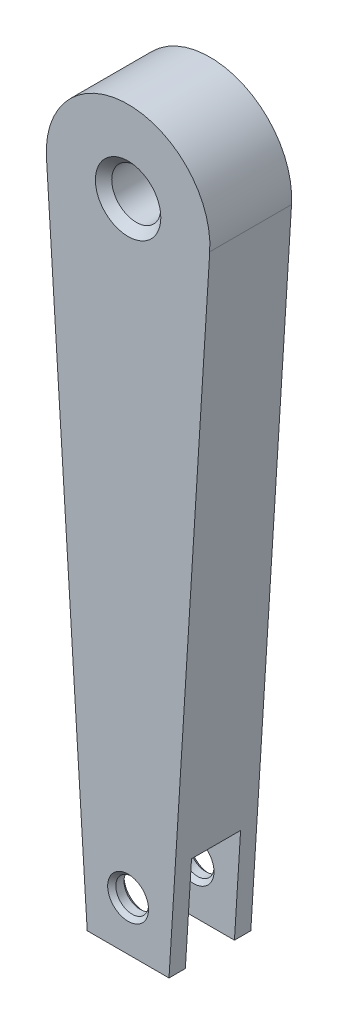
ISO-10303-21;
HEADER;
FILE_DESCRIPTION(('STEP AP214'),'2;1');
FILE_NAME('part.step','',(''),(''),'','','');
FILE_SCHEMA(('AUTOMOTIVE_DESIGN { 1 0 10303 214 1 1 1 1 }'));
ENDSEC;
DATA;
#1=APPLICATION_CONTEXT('core data for automotive mechanical design processes');
#2=APPLICATION_PROTOCOL_DEFINITION('international standard','automotive_design',2000,#1);
#3=PRODUCT_CONTEXT('',#1,'mechanical');
#4=PRODUCT('Part','Part','',(#3));
#5=PRODUCT_RELATED_PRODUCT_CATEGORY('part','',(#4));
#6=PRODUCT_DEFINITION_FORMATION('','',#4);
#7=PRODUCT_DEFINITION_CONTEXT('part definition',#1,'design');
#8=PRODUCT_DEFINITION('design','',#6,#7);
#9=PRODUCT_DEFINITION_SHAPE('','',#8);
#10=(LENGTH_UNIT() NAMED_UNIT(*) SI_UNIT(.MILLI.,.METRE.));
#11=(NAMED_UNIT(*) PLANE_ANGLE_UNIT() SI_UNIT($,.RADIAN.));
#12=(NAMED_UNIT(*) SI_UNIT($,.STERADIAN.) SOLID_ANGLE_UNIT());
#13=UNCERTAINTY_MEASURE_WITH_UNIT(LENGTH_MEASURE(1.E-05),#10,'distance_accuracy_value','');
#14=(GEOMETRIC_REPRESENTATION_CONTEXT(3) GLOBAL_UNCERTAINTY_ASSIGNED_CONTEXT((#13)) GLOBAL_UNIT_ASSIGNED_CONTEXT((#10,
#11,#12)) REPRESENTATION_CONTEXT('',''));
#15=CARTESIAN_POINT('',(0.,0.,0.));
#16=DIRECTION('',(0.,0.,1.));
#17=DIRECTION('',(1.,0.,0.));
#18=AXIS2_PLACEMENT_3D('',#15,#16,#17);
#19=CARTESIAN_POINT('',(-4.99999999999999,-80.,91.8451418704305));
#20=DIRECTION('',(0.,1.,0.));
#21=DIRECTION('',(0.,0.,1.));
#22=AXIS2_PLACEMENT_3D('',#19,#20,#21);
#23=PLANE('',#22);
#24=DIRECTION('',(0.,0.,-1.));
#25=VECTOR('',#24,1.);
#26=CARTESIAN_POINT('',(-4.99999999999999,-80.,91.8451418704305));
#27=LINE('',#26,#25);
#28=CARTESIAN_POINT('',(-4.99999999999999,-80.,9.99999999999999));
#29=VERTEX_POINT('',#28);
#30=CARTESIAN_POINT('',(-4.99999999999999,-80.,8.00000000000001));
#31=VERTEX_POINT('',#30);
#32=EDGE_CURVE('E152',#29,#31,#27,.T.);
#33=ORIENTED_EDGE('',*,*,#32,.T.);
#34=DIRECTION('',(1.,0.,0.));
#35=VECTOR('',#34,1.);
#36=CARTESIAN_POINT('',(-4.99999999999999,-80.,8.00000000000001));
#37=LINE('',#36,#35);
#38=CARTESIAN_POINT('',(5.00000000000001,-80.,8.00000000000001));
#39=VERTEX_POINT('',#38);
#40=EDGE_CURVE('E127',#31,#39,#37,.T.);
#41=ORIENTED_EDGE('',*,*,#40,.T.);
#42=DIRECTION('',(0.,0.,-1.));
#43=VECTOR('',#42,1.);
#44=CARTESIAN_POINT('',(5.00000000000001,-80.,91.8451418704305));
#45=LINE('',#44,#43);
#46=CARTESIAN_POINT('',(5.00000000000001,-80.,9.99999999999999));
#47=VERTEX_POINT('',#46);
#48=EDGE_CURVE('E147',#47,#39,#45,.T.);
#49=ORIENTED_EDGE('',*,*,#48,.F.);
#50=DIRECTION('',(1.,0.,0.));
#51=VECTOR('',#50,1.);
#52=CARTESIAN_POINT('',(-4.99999999999999,-80.,9.99999999999999));
#53=LINE('',#52,#51);
#54=EDGE_CURVE('E157',#29,#47,#53,.T.);
#55=ORIENTED_EDGE('',*,*,#54,.F.);
#56=EDGE_LOOP('',(#33,#41,#49,#55));
#57=FACE_BOUND('',#56,.T.);
#58=ADVANCED_FACE('F40',(#57),#23,.F.);
#59=CARTESIAN_POINT('',(0.,0.,10.));
#60=DIRECTION('',(0.,0.,-1.));
#61=DIRECTION('',(-1.,0.,0.));
#62=AXIS2_PLACEMENT_3D('',#59,#60,#61);
#63=CYLINDRICAL_SURFACE('',#62,10.);
#64=CARTESIAN_POINT('',(0.,0.,10.));
#65=DIRECTION('',(0.,0.,1.));
#66=DIRECTION('',(1.,0.,0.));
#67=AXIS2_PLACEMENT_3D('',#64,#65,#66);
#68=CIRCLE('',#67,10.);
#69=CARTESIAN_POINT('',(9.98037274433424,-0.626226703479116,10.));
#70=VERTEX_POINT('',#69);
#71=CARTESIAN_POINT('',(-9.98037274433424,-0.626226703479112,10.));
#72=VERTEX_POINT('',#71);
#73=EDGE_CURVE('E64',#70,#72,#68,.T.);
#74=ORIENTED_EDGE('',*,*,#73,.F.);
#75=DIRECTION('',(0.,0.,-1.));
#76=VECTOR('',#75,1.);
#77=CARTESIAN_POINT('',(9.98037274433424,-0.626226703479116,91.8451418704305));
#78=LINE('',#77,#76);
#79=CARTESIAN_POINT('',(9.98037274433424,-0.626226703479116,0.));
#80=VERTEX_POINT('',#79);
#81=EDGE_CURVE('E146',#70,#80,#78,.T.);
#82=ORIENTED_EDGE('',*,*,#81,.T.);
#83=CARTESIAN_POINT('',(0.,0.,0.));
#84=DIRECTION('',(0.,0.,1.));
#85=DIRECTION('',(1.,0.,0.));
#86=AXIS2_PLACEMENT_3D('',#83,#84,#85);
#87=CIRCLE('',#86,10.);
#88=CARTESIAN_POINT('',(-9.98037274433424,-0.626226703479112,0.));
#89=VERTEX_POINT('',#88);
#90=EDGE_CURVE('E156',#80,#89,#87,.T.);
#91=ORIENTED_EDGE('',*,*,#90,.T.);
#92=DIRECTION('',(0.,0.,-1.));
#93=VECTOR('',#92,1.);
#94=CARTESIAN_POINT('',(-9.98037274433424,-0.626226703479113,91.8451418704305));
#95=LINE('',#94,#93);
#96=EDGE_CURVE('E142',#72,#89,#95,.T.);
#97=ORIENTED_EDGE('',*,*,#96,.F.);
#98=EDGE_LOOP('',(#74,#82,#91,#97));
#99=FACE_BOUND('',#98,.T.);
#100=ADVANCED_FACE('F233',(#99),#63,.T.);
#101=CARTESIAN_POINT('',(0.,0.,10.));
#102=DIRECTION('',(0.,0.,1.));
#103=DIRECTION('',(1.,0.,0.));
#104=AXIS2_PLACEMENT_3D('',#101,#102,#103);
#105=PLANE('',#104);
#106=CARTESIAN_POINT('',(0.,-74.,10.));
#107=DIRECTION('',(0.,0.,1.));
#108=DIRECTION('',(1.,0.,0.));
#109=AXIS2_PLACEMENT_3D('',#106,#107,#108);
#110=CIRCLE('',#109,2.5);
#111=CARTESIAN_POINT('',(2.5,-74.,10.));
#112=VERTEX_POINT('',#111);
#113=EDGE_CURVE('E11',#112,#112,#110,.F.);
#114=ORIENTED_EDGE('',*,*,#113,.T.);
#115=EDGE_LOOP('',(#114));
#116=FACE_BOUND('',#115,.T.);
#117=CARTESIAN_POINT('',(0.,0.,10.));
#118=DIRECTION('',(0.,0.,1.));
#119=DIRECTION('',(1.,0.,0.));
#120=AXIS2_PLACEMENT_3D('',#117,#118,#119);
#121=CIRCLE('',#120,3.99999999999999);
#122=CARTESIAN_POINT('',(3.99999999999999,0.,10.));
#123=VERTEX_POINT('',#122);
#124=EDGE_CURVE('E176',#123,#123,#121,.F.);
#125=ORIENTED_EDGE('',*,*,#124,.T.);
#126=EDGE_LOOP('',(#125));
#127=FACE_BOUND('',#126,.T.);
#128=ORIENTED_EDGE('',*,*,#73,.T.);
#129=DIRECTION('',(0.0626226703479112,-0.998037274433424,0.));
#130=VECTOR('',#129,1.);
#131=CARTESIAN_POINT('',(-9.98037274433424,-0.626226703479113,9.99999999999999));
#132=LINE('',#131,#130);
#133=EDGE_CURVE('E141',#72,#29,#132,.T.);
#134=ORIENTED_EDGE('',*,*,#133,.T.);
#135=ORIENTED_EDGE('',*,*,#54,.T.);
#136=DIRECTION('',(0.062622670347911,0.998037274433424,0.));
#137=VECTOR('',#136,1.);
#138=CARTESIAN_POINT('',(9.98037274433424,-0.62622670347911,9.99999999999999));
#139=LINE('',#138,#137);
#140=EDGE_CURVE('E153',#47,#70,#139,.T.);
#141=ORIENTED_EDGE('',*,*,#140,.T.);
#142=EDGE_LOOP('',(#128,#134,#135,#141));
#143=FACE_BOUND('',#142,.T.);
#144=ADVANCED_FACE('F223',(#116,#127,#143),#105,.T.);
#145=CARTESIAN_POINT('',(0.,0.,0.));
#146=DIRECTION('',(0.,0.,1.));
#147=DIRECTION('',(1.,0.,0.));
#148=AXIS2_PLACEMENT_3D('',#145,#146,#147);
#149=PLANE('',#148);
#150=CARTESIAN_POINT('',(0.,-74.,0.));
#151=DIRECTION('',(0.,0.,1.));
#152=DIRECTION('',(1.,0.,0.));
#153=AXIS2_PLACEMENT_3D('',#150,#151,#152);
#154=CIRCLE('',#153,2.49999999999999);
#155=CARTESIAN_POINT('',(2.49999999999999,-74.,0.));
#156=VERTEX_POINT('',#155);
#157=EDGE_CURVE('E182',#156,#156,#154,.T.);
#158=ORIENTED_EDGE('',*,*,#157,.T.);
#159=EDGE_LOOP('',(#158));
#160=FACE_BOUND('',#159,.T.);
#161=CARTESIAN_POINT('',(0.,0.,0.));
#162=DIRECTION('',(0.,0.,-1.));
#163=DIRECTION('',(-1.,0.,0.));
#164=AXIS2_PLACEMENT_3D('',#161,#162,#163);
#165=CIRCLE('',#164,3.);
#166=CARTESIAN_POINT('',(-3.,0.,0.));
#167=VERTEX_POINT('',#166);
#168=EDGE_CURVE('E134',#167,#167,#165,.T.);
#169=ORIENTED_EDGE('',*,*,#168,.F.);
#170=EDGE_LOOP('',(#169));
#171=FACE_BOUND('',#170,.T.);
#172=ORIENTED_EDGE('',*,*,#90,.F.);
#173=DIRECTION('',(0.062622670347911,0.998037274433424,0.));
#174=VECTOR('',#173,1.);
#175=CARTESIAN_POINT('',(9.98037274433424,-0.62622670347911,0.));
#176=LINE('',#175,#174);
#177=CARTESIAN_POINT('',(5.00000000000001,-80.,0.));
#178=VERTEX_POINT('',#177);
#179=EDGE_CURVE('E143',#178,#80,#176,.T.);
#180=ORIENTED_EDGE('',*,*,#179,.F.);
#181=DIRECTION('',(1.,0.,0.));
#182=VECTOR('',#181,1.);
#183=CARTESIAN_POINT('',(-4.99999999999999,-80.,0.));
#184=LINE('',#183,#182);
#185=CARTESIAN_POINT('',(-4.99999999999999,-80.,0.));
#186=VERTEX_POINT('',#185);
#187=EDGE_CURVE('E148',#186,#178,#184,.T.);
#188=ORIENTED_EDGE('',*,*,#187,.F.);
#189=DIRECTION('',(0.0626226703479112,-0.998037274433424,0.));
#190=VECTOR('',#189,1.);
#191=CARTESIAN_POINT('',(-9.98037274433424,-0.626226703479113,0.));
#192=LINE('',#191,#190);
#193=EDGE_CURVE('E138',#89,#186,#192,.T.);
#194=ORIENTED_EDGE('',*,*,#193,.F.);
#195=EDGE_LOOP('',(#172,#180,#188,#194));
#196=FACE_BOUND('',#195,.T.);
#197=ADVANCED_FACE('F228',(#160,#171,#196),#149,.F.);
#198=CARTESIAN_POINT('',(5.00000000000001,-80.,2.));
#199=VERTEX_POINT('',#198);
#200=EDGE_CURVE('E151',#199,#178,#45,.T.);
#201=ORIENTED_EDGE('',*,*,#200,.F.);
#202=DIRECTION('',(-1.,0.,0.));
#203=VECTOR('',#202,1.);
#204=CARTESIAN_POINT('',(-4.99999999999999,-80.,2.));
#205=LINE('',#204,#203);
#206=CARTESIAN_POINT('',(-4.99999999999999,-80.,2.00000000000001));
#207=VERTEX_POINT('',#206);
#208=EDGE_CURVE('E108',#199,#207,#205,.T.);
#209=ORIENTED_EDGE('',*,*,#208,.T.);
#210=EDGE_CURVE('E137',#207,#186,#27,.T.);
#211=ORIENTED_EDGE('',*,*,#210,.T.);
#212=ORIENTED_EDGE('',*,*,#187,.T.);
#213=EDGE_LOOP('',(#201,#209,#211,#212));
#214=FACE_BOUND('',#213,.T.);
#215=ADVANCED_FACE('F231',(#214),#23,.F.);
#216=CARTESIAN_POINT('',(9.98037274433424,-0.62622670347911,91.8451418704305));
#217=DIRECTION('',(-0.998037274433424,0.062622670347911,0.));
#218=DIRECTION('',(-0.062622670347911,-0.998037274433424,0.));
#219=AXIS2_PLACEMENT_3D('',#216,#217,#218);
#220=PLANE('',#219);
#221=ORIENTED_EDGE('',*,*,#48,.T.);
#222=DIRECTION('',(0.062622670347911,0.998037274433424,0.));
#223=VECTOR('',#222,1.);
#224=CARTESIAN_POINT('',(9.98037274433424,-0.62622670347911,8.00000000000001));
#225=LINE('',#224,#223);
#226=CARTESIAN_POINT('',(5.75294987815114,-68.,8.));
#227=VERTEX_POINT('',#226);
#228=EDGE_CURVE('E126',#39,#227,#225,.T.);
#229=ORIENTED_EDGE('',*,*,#228,.T.);
#230=DIRECTION('',(0.,0.,-1.));
#231=VECTOR('',#230,1.);
#232=CARTESIAN_POINT('',(5.75294987815114,-68.,91.8451418704305));
#233=LINE('',#232,#231);
#234=CARTESIAN_POINT('',(5.75294987815114,-68.,2.00000000000001));
#235=VERTEX_POINT('',#234);
#236=EDGE_CURVE('E112',#227,#235,#233,.T.);
#237=ORIENTED_EDGE('',*,*,#236,.T.);
#238=DIRECTION('',(-0.062622670347911,-0.998037274433424,0.));
#239=VECTOR('',#238,1.);
#240=CARTESIAN_POINT('',(9.98037274433424,-0.626226703479101,2.00000000000002));
#241=LINE('',#240,#239);
#242=EDGE_CURVE('E105',#235,#199,#241,.T.);
#243=ORIENTED_EDGE('',*,*,#242,.T.);
#244=ORIENTED_EDGE('',*,*,#200,.T.);
#245=ORIENTED_EDGE('',*,*,#179,.T.);
#246=ORIENTED_EDGE('',*,*,#81,.F.);
#247=ORIENTED_EDGE('',*,*,#140,.F.);
#248=EDGE_LOOP('',(#221,#229,#237,#243,#244,#245,#246,#247));
#249=FACE_BOUND('',#248,.T.);
#250=ADVANCED_FACE('F125',(#249),#220,.F.);
#251=CARTESIAN_POINT('',(-9.98037274433424,-0.626226703479113,91.8451418704305));
#252=DIRECTION('',(0.998037274433424,0.0626226703479112,0.));
#253=DIRECTION('',(-0.0626226703479112,0.998037274433424,0.));
#254=AXIS2_PLACEMENT_3D('',#251,#252,#253);
#255=PLANE('',#254);
#256=DIRECTION('',(0.,0.,1.));
#257=VECTOR('',#256,1.);
#258=CARTESIAN_POINT('',(-5.75294987815112,-68.,91.8451418704305));
#259=LINE('',#258,#257);
#260=CARTESIAN_POINT('',(-5.75294987815112,-68.,2.00000000000001));
#261=VERTEX_POINT('',#260);
#262=CARTESIAN_POINT('',(-5.75294987815112,-68.,8.));
#263=VERTEX_POINT('',#262);
#264=EDGE_CURVE('E119',#261,#263,#259,.T.);
#265=ORIENTED_EDGE('',*,*,#264,.T.);
#266=DIRECTION('',(0.0626226703479112,-0.998037274433424,0.));
#267=VECTOR('',#266,1.);
#268=CARTESIAN_POINT('',(-9.98037274433424,-0.626226703479113,8.00000000000001));
#269=LINE('',#268,#267);
#270=EDGE_CURVE('E173',#263,#31,#269,.T.);
#271=ORIENTED_EDGE('',*,*,#270,.T.);
#272=ORIENTED_EDGE('',*,*,#32,.F.);
#273=ORIENTED_EDGE('',*,*,#133,.F.);
#274=ORIENTED_EDGE('',*,*,#96,.T.);
#275=ORIENTED_EDGE('',*,*,#193,.T.);
#276=ORIENTED_EDGE('',*,*,#210,.F.);
#277=DIRECTION('',(-0.0626226703479112,0.998037274433424,0.));
#278=VECTOR('',#277,1.);
#279=CARTESIAN_POINT('',(-9.98037274433424,-0.626226703479103,2.00000000000002));
#280=LINE('',#279,#278);
#281=EDGE_CURVE('E169',#207,#261,#280,.T.);
#282=ORIENTED_EDGE('',*,*,#281,.T.);
#283=EDGE_LOOP('',(#265,#271,#272,#273,#274,#275,#276,#282));
#284=FACE_BOUND('',#283,.T.);
#285=ADVANCED_FACE('F219',(#284),#255,.F.);
#286=CARTESIAN_POINT('',(0.,0.,10.));
#287=DIRECTION('',(0.,0.,-1.));
#288=DIRECTION('',(-1.,0.,0.));
#289=AXIS2_PLACEMENT_3D('',#286,#287,#288);
#290=CYLINDRICAL_SURFACE('',#289,3.);
#291=CARTESIAN_POINT('',(0.,0.,9.00000000000001));
#292=DIRECTION('',(0.,0.,1.));
#293=DIRECTION('',(1.,0.,0.));
#294=AXIS2_PLACEMENT_3D('',#291,#292,#293);
#295=CIRCLE('',#294,3.);
#296=CARTESIAN_POINT('',(3.,0.,9.00000000000001));
#297=VERTEX_POINT('',#296);
#298=EDGE_CURVE('E179',#297,#297,#295,.T.);
#299=ORIENTED_EDGE('',*,*,#298,.T.);
#300=EDGE_LOOP('',(#299));
#301=FACE_BOUND('',#300,.T.);
#302=ORIENTED_EDGE('',*,*,#168,.T.);
#303=EDGE_LOOP('',(#302));
#304=FACE_BOUND('',#303,.T.);
#305=ADVANCED_FACE('F214',(#301,#304),#290,.F.);
#306=CARTESIAN_POINT('',(-10.,-68.,8.));
#307=DIRECTION('',(0.,0.,1.));
#308=DIRECTION('',(1.,0.,0.));
#309=AXIS2_PLACEMENT_3D('',#306,#307,#308);
#310=PLANE('',#309);
#311=CARTESIAN_POINT('',(0.,-74.,8.));
#312=DIRECTION('',(0.,0.,1.));
#313=DIRECTION('',(1.,0.,0.));
#314=AXIS2_PLACEMENT_3D('',#311,#312,#313);
#315=CIRCLE('',#314,2.5);
#316=CARTESIAN_POINT('',(2.5,-74.,8.));
#317=VERTEX_POINT('',#316);
#318=EDGE_CURVE('E194',#317,#317,#315,.T.);
#319=ORIENTED_EDGE('',*,*,#318,.T.);
#320=EDGE_LOOP('',(#319));
#321=FACE_BOUND('',#320,.T.);
#322=ORIENTED_EDGE('',*,*,#40,.F.);
#323=ORIENTED_EDGE('',*,*,#270,.F.);
#324=DIRECTION('',(1.,0.,0.));
#325=VECTOR('',#324,1.);
#326=CARTESIAN_POINT('',(-10.,-68.,8.));
#327=LINE('',#326,#325);
#328=EDGE_CURVE('E121',#263,#227,#327,.T.);
#329=ORIENTED_EDGE('',*,*,#328,.T.);
#330=ORIENTED_EDGE('',*,*,#228,.F.);
#331=EDGE_LOOP('',(#322,#323,#329,#330));
#332=FACE_BOUND('',#331,.T.);
#333=ADVANCED_FACE('F211',(#321,#332),#310,.F.);
#334=CARTESIAN_POINT('',(-10.,-68.,2.));
#335=DIRECTION('',(0.,1.,0.));
#336=DIRECTION('',(0.,0.,1.));
#337=AXIS2_PLACEMENT_3D('',#334,#335,#336);
#338=PLANE('',#337);
#339=ORIENTED_EDGE('',*,*,#328,.F.);
#340=ORIENTED_EDGE('',*,*,#264,.F.);
#341=DIRECTION('',(1.,0.,0.));
#342=VECTOR('',#341,1.);
#343=CARTESIAN_POINT('',(-10.,-68.,2.));
#344=LINE('',#343,#342);
#345=EDGE_CURVE('E56',#261,#235,#344,.T.);
#346=ORIENTED_EDGE('',*,*,#345,.T.);
#347=ORIENTED_EDGE('',*,*,#236,.F.);
#348=EDGE_LOOP('',(#339,#340,#346,#347));
#349=FACE_BOUND('',#348,.T.);
#350=ADVANCED_FACE('F116',(#349),#338,.F.);
#351=CARTESIAN_POINT('',(-10.,-68.,2.));
#352=DIRECTION('',(0.,0.,-1.));
#353=DIRECTION('',(0.,1.,0.));
#354=AXIS2_PLACEMENT_3D('',#351,#352,#353);
#355=PLANE('',#354);
#356=CARTESIAN_POINT('',(0.,-74.,2.));
#357=DIRECTION('',(0.,0.,-1.));
#358=DIRECTION('',(0.,1.,0.));
#359=AXIS2_PLACEMENT_3D('',#356,#357,#358);
#360=CIRCLE('',#359,2.49999999999999);
#361=CARTESIAN_POINT('',(0.,-71.5,2.));
#362=VERTEX_POINT('',#361);
#363=EDGE_CURVE('E191',#362,#362,#360,.T.);
#364=ORIENTED_EDGE('',*,*,#363,.T.);
#365=EDGE_LOOP('',(#364));
#366=FACE_BOUND('',#365,.T.);
#367=ORIENTED_EDGE('',*,*,#345,.F.);
#368=ORIENTED_EDGE('',*,*,#281,.F.);
#369=ORIENTED_EDGE('',*,*,#208,.F.);
#370=ORIENTED_EDGE('',*,*,#242,.F.);
#371=EDGE_LOOP('',(#367,#368,#369,#370));
#372=FACE_BOUND('',#371,.T.);
#373=ADVANCED_FACE('F106',(#366,#372),#355,.F.);
#374=CARTESIAN_POINT('',(0.,-74.,0.));
#375=DIRECTION('',(0.,0.,1.));
#376=DIRECTION('',(1.,0.,0.));
#377=AXIS2_PLACEMENT_3D('',#374,#375,#376);
#378=CYLINDRICAL_SURFACE('',#377,2.);
#379=CARTESIAN_POINT('',(0.,-74.,0.499999999999981));
#380=DIRECTION('',(0.,0.,1.));
#381=DIRECTION('',(1.,0.,0.));
#382=AXIS2_PLACEMENT_3D('',#379,#380,#381);
#383=CIRCLE('',#382,2.);
#384=CARTESIAN_POINT('',(2.,-74.,0.499999999999981));
#385=VERTEX_POINT('',#384);
#386=EDGE_CURVE('E188',#385,#385,#383,.F.);
#387=ORIENTED_EDGE('',*,*,#386,.T.);
#388=EDGE_LOOP('',(#387));
#389=FACE_BOUND('',#388,.T.);
#390=CARTESIAN_POINT('',(0.,-74.,1.50000000000001));
#391=DIRECTION('',(0.,0.,-1.));
#392=DIRECTION('',(-1.,0.,0.));
#393=AXIS2_PLACEMENT_3D('',#390,#391,#392);
#394=CIRCLE('',#393,2.);
#395=CARTESIAN_POINT('',(-2.,-74.,1.50000000000001));
#396=VERTEX_POINT('',#395);
#397=EDGE_CURVE('E185',#396,#396,#394,.F.);
#398=ORIENTED_EDGE('',*,*,#397,.T.);
#399=EDGE_LOOP('',(#398));
#400=FACE_BOUND('',#399,.T.);
#401=ADVANCED_FACE('F276',(#389,#400),#378,.F.);
#402=CARTESIAN_POINT('',(0.,-74.,8.49999999999999));
#403=DIRECTION('',(0.,0.,1.));
#404=DIRECTION('',(1.,0.,0.));
#405=AXIS2_PLACEMENT_3D('',#402,#403,#404);
#406=CIRCLE('',#405,2.);
#407=CARTESIAN_POINT('',(2.,-74.,8.49999999999999));
#408=VERTEX_POINT('',#407);
#409=EDGE_CURVE('E49',#408,#408,#406,.F.);
#410=ORIENTED_EDGE('',*,*,#409,.T.);
#411=EDGE_LOOP('',(#410));
#412=FACE_BOUND('',#411,.T.);
#413=CARTESIAN_POINT('',(0.,-74.,9.50000000000001));
#414=DIRECTION('',(0.,0.,1.));
#415=DIRECTION('',(1.,0.,0.));
#416=AXIS2_PLACEMENT_3D('',#413,#414,#415);
#417=CIRCLE('',#416,2.);
#418=CARTESIAN_POINT('',(2.,-74.,9.50000000000001));
#419=VERTEX_POINT('',#418);
#420=EDGE_CURVE('E197',#419,#419,#417,.T.);
#421=ORIENTED_EDGE('',*,*,#420,.T.);
#422=EDGE_LOOP('',(#421));
#423=FACE_BOUND('',#422,.T.);
#424=ADVANCED_FACE('F202',(#412,#423),#378,.F.);
#425=CARTESIAN_POINT('',(0.,0.,10.));
#426=DIRECTION('',(0.,0.,1.));
#427=DIRECTION('',(1.,0.,0.));
#428=AXIS2_PLACEMENT_3D('',#425,#426,#427);
#429=CONICAL_SURFACE('',#428,3.99999999999999,0.785398163397447);
#430=ORIENTED_EDGE('',*,*,#298,.F.);
#431=EDGE_LOOP('',(#430));
#432=FACE_BOUND('',#431,.T.);
#433=ORIENTED_EDGE('',*,*,#124,.F.);
#434=EDGE_LOOP('',(#433));
#435=FACE_BOUND('',#434,.T.);
#436=ADVANCED_FACE('F246',(#432,#435),#429,.F.);
#437=CARTESIAN_POINT('',(0.,-74.,0.));
#438=DIRECTION('',(0.,0.,-1.));
#439=DIRECTION('',(-1.,0.,0.));
#440=AXIS2_PLACEMENT_3D('',#437,#438,#439);
#441=CONICAL_SURFACE('',#440,2.49999999999999,0.785398163397455);
#442=ORIENTED_EDGE('',*,*,#386,.F.);
#443=EDGE_LOOP('',(#442));
#444=FACE_BOUND('',#443,.T.);
#445=ORIENTED_EDGE('',*,*,#157,.F.);
#446=EDGE_LOOP('',(#445));
#447=FACE_BOUND('',#446,.T.);
#448=ADVANCED_FACE('F252',(#444,#447),#441,.F.);
#449=CARTESIAN_POINT('',(0.,-74.,2.));
#450=DIRECTION('',(0.,0.,1.));
#451=DIRECTION('',(1.,0.,0.));
#452=AXIS2_PLACEMENT_3D('',#449,#450,#451);
#453=CONICAL_SURFACE('',#452,2.49999999999999,0.785398163397441);
#454=ORIENTED_EDGE('',*,*,#397,.F.);
#455=EDGE_LOOP('',(#454));
#456=FACE_BOUND('',#455,.T.);
#457=ORIENTED_EDGE('',*,*,#363,.F.);
#458=EDGE_LOOP('',(#457));
#459=FACE_BOUND('',#458,.T.);
#460=ADVANCED_FACE('F208',(#456,#459),#453,.F.);
#461=CARTESIAN_POINT('',(0.,-74.,8.));
#462=DIRECTION('',(0.,0.,-1.));
#463=DIRECTION('',(-1.,0.,0.));
#464=AXIS2_PLACEMENT_3D('',#461,#462,#463);
#465=CONICAL_SURFACE('',#464,2.5,0.785398163397456);
#466=ORIENTED_EDGE('',*,*,#409,.F.);
#467=EDGE_LOOP('',(#466));
#468=FACE_BOUND('',#467,.T.);
#469=ORIENTED_EDGE('',*,*,#318,.F.);
#470=EDGE_LOOP('',(#469));
#471=FACE_BOUND('',#470,.T.);
#472=ADVANCED_FACE('F205',(#468,#471),#465,.F.);
#473=CARTESIAN_POINT('',(0.,-74.,9.50000000000001));
#474=DIRECTION('',(0.,0.,1.));
#475=DIRECTION('',(1.,0.,0.));
#476=AXIS2_PLACEMENT_3D('',#473,#474,#475);
#477=CONICAL_SURFACE('',#476,2.,0.785398163397456);
#478=ORIENTED_EDGE('',*,*,#113,.F.);
#479=EDGE_LOOP('',(#478));
#480=FACE_BOUND('',#479,.T.);
#481=ORIENTED_EDGE('',*,*,#420,.F.);
#482=EDGE_LOOP('',(#481));
#483=FACE_BOUND('',#482,.T.);
#484=ADVANCED_FACE('F43',(#480,#483),#477,.F.);
#485=CLOSED_SHELL('',(#58,#100,#144,#197,#215,#250,#285,#305,#333,#350,#373,#401,#424,#436,#448,
#460,#472,#484));
#486=MANIFOLD_SOLID_BREP('B2',#485);
#487=ADVANCED_BREP_SHAPE_REPRESENTATION('',(#18,#486),#14);
#488=SHAPE_DEFINITION_REPRESENTATION(#9,#487);
ENDSEC;
END-ISO-10303-21;
